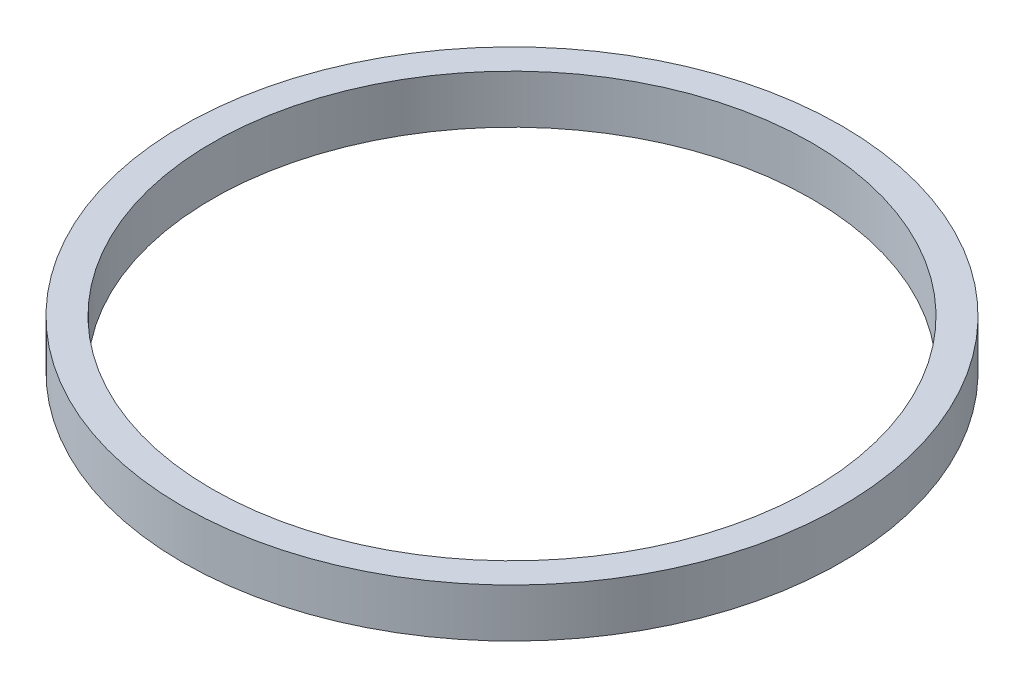
ISO-10303-21;
HEADER;
FILE_DESCRIPTION(('STEP AP214'),'2;1');
FILE_NAME('part.step','',(''),(''),'','','');
FILE_SCHEMA(('AUTOMOTIVE_DESIGN { 1 0 10303 214 1 1 1 1 }'));
ENDSEC;
DATA;
#1=APPLICATION_CONTEXT('core data for automotive mechanical design processes');
#2=APPLICATION_PROTOCOL_DEFINITION('international standard','automotive_design',2000,#1);
#3=PRODUCT_CONTEXT('',#1,'mechanical');
#4=PRODUCT('Part','Part','',(#3));
#5=PRODUCT_RELATED_PRODUCT_CATEGORY('part','',(#4));
#6=PRODUCT_DEFINITION_FORMATION('','',#4);
#7=PRODUCT_DEFINITION_CONTEXT('part definition',#1,'design');
#8=PRODUCT_DEFINITION('design','',#6,#7);
#9=PRODUCT_DEFINITION_SHAPE('','',#8);
#10=(LENGTH_UNIT() NAMED_UNIT(*) SI_UNIT(.MILLI.,.METRE.));
#11=(NAMED_UNIT(*) PLANE_ANGLE_UNIT() SI_UNIT($,.RADIAN.));
#12=(NAMED_UNIT(*) SI_UNIT($,.STERADIAN.) SOLID_ANGLE_UNIT());
#13=UNCERTAINTY_MEASURE_WITH_UNIT(LENGTH_MEASURE(1.E-05),#10,'distance_accuracy_value','');
#14=(GEOMETRIC_REPRESENTATION_CONTEXT(3) GLOBAL_UNCERTAINTY_ASSIGNED_CONTEXT((#13)) GLOBAL_UNIT_ASSIGNED_CONTEXT((#10,
#11,#12)) REPRESENTATION_CONTEXT('',''));
#15=CARTESIAN_POINT('',(0.,0.,0.));
#16=DIRECTION('',(0.,0.,1.));
#17=DIRECTION('',(1.,0.,0.));
#18=AXIS2_PLACEMENT_3D('',#15,#16,#17);
#19=CARTESIAN_POINT('',(0.,2.78,0.));
#20=DIRECTION('',(0.,-1.,0.));
#21=DIRECTION('',(0.,0.,-1.));
#22=AXIS2_PLACEMENT_3D('',#19,#20,#21);
#23=CYLINDRICAL_SURFACE('',#22,18.87);
#24=CARTESIAN_POINT('',(0.,2.78,0.));
#25=DIRECTION('',(0.,1.,0.));
#26=DIRECTION('',(0.,0.,1.));
#27=AXIS2_PLACEMENT_3D('',#24,#25,#26);
#28=CIRCLE('',#27,18.87);
#29=CARTESIAN_POINT('',(0.,2.78,18.87));
#30=VERTEX_POINT('',#29);
#31=EDGE_CURVE('E10',#30,#30,#28,.T.);
#32=ORIENTED_EDGE('',*,*,#31,.F.);
#33=EDGE_LOOP('',(#32));
#34=FACE_BOUND('',#33,.T.);
#35=CARTESIAN_POINT('',(0.,0.,0.));
#36=DIRECTION('',(0.,1.,0.));
#37=DIRECTION('',(0.,0.,1.));
#38=AXIS2_PLACEMENT_3D('',#35,#36,#37);
#39=CIRCLE('',#38,18.87);
#40=CARTESIAN_POINT('',(0.,0.,18.87));
#41=VERTEX_POINT('',#40);
#42=EDGE_CURVE('E37',#41,#41,#39,.T.);
#43=ORIENTED_EDGE('',*,*,#42,.T.);
#44=EDGE_LOOP('',(#43));
#45=FACE_BOUND('',#44,.T.);
#46=ADVANCED_FACE('F30',(#34,#45),#23,.T.);
#47=CARTESIAN_POINT('',(0.,2.78,0.));
#48=DIRECTION('',(0.,1.,0.));
#49=DIRECTION('',(0.,0.,1.));
#50=AXIS2_PLACEMENT_3D('',#47,#48,#49);
#51=PLANE('',#50);
#52=CARTESIAN_POINT('',(0.,2.78,0.));
#53=DIRECTION('',(0.,1.,0.));
#54=DIRECTION('',(0.,0.,1.));
#55=AXIS2_PLACEMENT_3D('',#52,#53,#54);
#56=CIRCLE('',#55,17.17);
#57=CARTESIAN_POINT('',(0.,2.78,17.17));
#58=VERTEX_POINT('',#57);
#59=EDGE_CURVE('E42',#58,#58,#56,.F.);
#60=ORIENTED_EDGE('',*,*,#59,.T.);
#61=EDGE_LOOP('',(#60));
#62=FACE_BOUND('',#61,.T.);
#63=ORIENTED_EDGE('',*,*,#31,.T.);
#64=EDGE_LOOP('',(#63));
#65=FACE_BOUND('',#64,.T.);
#66=ADVANCED_FACE('F55',(#62,#65),#51,.T.);
#67=CARTESIAN_POINT('',(0.,0.,0.));
#68=DIRECTION('',(0.,1.,0.));
#69=DIRECTION('',(0.,0.,1.));
#70=AXIS2_PLACEMENT_3D('',#67,#68,#69);
#71=PLANE('',#70);
#72=CARTESIAN_POINT('',(0.,0.,0.));
#73=DIRECTION('',(0.,1.,0.));
#74=DIRECTION('',(0.,0.,1.));
#75=AXIS2_PLACEMENT_3D('',#72,#73,#74);
#76=CIRCLE('',#75,17.17);
#77=CARTESIAN_POINT('',(0.,0.,17.17));
#78=VERTEX_POINT('',#77);
#79=EDGE_CURVE('E33',#78,#78,#76,.F.);
#80=ORIENTED_EDGE('',*,*,#79,.F.);
#81=EDGE_LOOP('',(#80));
#82=FACE_BOUND('',#81,.T.);
#83=ORIENTED_EDGE('',*,*,#42,.F.);
#84=EDGE_LOOP('',(#83));
#85=FACE_BOUND('',#84,.T.);
#86=ADVANCED_FACE('F52',(#82,#85),#71,.F.);
#87=CARTESIAN_POINT('',(0.,6.78,0.));
#88=DIRECTION('',(0.,-1.,0.));
#89=DIRECTION('',(0.,0.,-1.));
#90=AXIS2_PLACEMENT_3D('',#87,#88,#89);
#91=CYLINDRICAL_SURFACE('',#90,17.17);
#92=ORIENTED_EDGE('',*,*,#59,.F.);
#93=EDGE_LOOP('',(#92));
#94=FACE_BOUND('',#93,.T.);
#95=ORIENTED_EDGE('',*,*,#79,.T.);
#96=EDGE_LOOP('',(#95));
#97=FACE_BOUND('',#96,.T.);
#98=ADVANCED_FACE('F50',(#94,#97),#91,.F.);
#99=CLOSED_SHELL('',(#46,#66,#86,#98));
#100=MANIFOLD_SOLID_BREP('B2',#99);
#101=ADVANCED_BREP_SHAPE_REPRESENTATION('',(#18,#100),#14);
#102=SHAPE_DEFINITION_REPRESENTATION(#9,#101);
ENDSEC;
END-ISO-10303-21;
